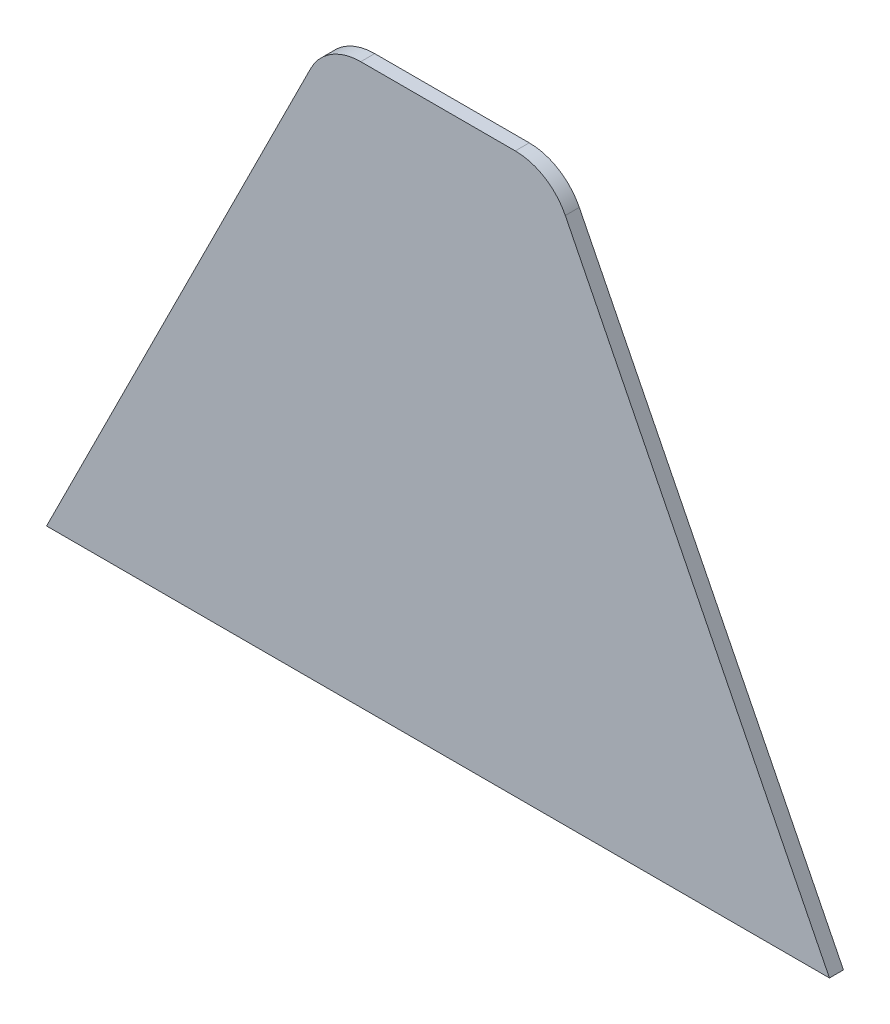
ISO-10303-21;
HEADER;
FILE_DESCRIPTION(('STEP AP214'),'2;1');
FILE_NAME('part.step','',(''),(''),'','','');
FILE_SCHEMA(('AUTOMOTIVE_DESIGN { 1 0 10303 214 1 1 1 1 }'));
ENDSEC;
DATA;
#1=APPLICATION_CONTEXT('core data for automotive mechanical design processes');
#2=APPLICATION_PROTOCOL_DEFINITION('international standard','automotive_design',2000,#1);
#3=PRODUCT_CONTEXT('',#1,'mechanical');
#4=PRODUCT('Part','Part','',(#3));
#5=PRODUCT_RELATED_PRODUCT_CATEGORY('part','',(#4));
#6=PRODUCT_DEFINITION_FORMATION('','',#4);
#7=PRODUCT_DEFINITION_CONTEXT('part definition',#1,'design');
#8=PRODUCT_DEFINITION('design','',#6,#7);
#9=PRODUCT_DEFINITION_SHAPE('','',#8);
#10=(LENGTH_UNIT() NAMED_UNIT(*) SI_UNIT(.MILLI.,.METRE.));
#11=(NAMED_UNIT(*) PLANE_ANGLE_UNIT() SI_UNIT($,.RADIAN.));
#12=(NAMED_UNIT(*) SI_UNIT($,.STERADIAN.) SOLID_ANGLE_UNIT());
#13=UNCERTAINTY_MEASURE_WITH_UNIT(LENGTH_MEASURE(1.E-05),#10,'distance_accuracy_value','');
#14=(GEOMETRIC_REPRESENTATION_CONTEXT(3) GLOBAL_UNCERTAINTY_ASSIGNED_CONTEXT((#13)) GLOBAL_UNIT_ASSIGNED_CONTEXT((#10,
#11,#12)) REPRESENTATION_CONTEXT('',''));
#15=CARTESIAN_POINT('',(0.,0.,0.));
#16=DIRECTION('',(0.,0.,1.));
#17=DIRECTION('',(1.,0.,0.));
#18=AXIS2_PLACEMENT_3D('',#15,#16,#17);
#19=CARTESIAN_POINT('',(177.8,0.,3.175));
#20=DIRECTION('',(0.,1.,0.));
#21=DIRECTION('',(0.,0.,1.));
#22=AXIS2_PLACEMENT_3D('',#19,#20,#21);
#23=PLANE('',#22);
#24=DIRECTION('',(1.,0.,0.));
#25=VECTOR('',#24,1.);
#26=CARTESIAN_POINT('',(177.8,0.,0.));
#27=LINE('',#26,#25);
#28=CARTESIAN_POINT('',(0.,0.,0.));
#29=VERTEX_POINT('',#28);
#30=CARTESIAN_POINT('',(177.8,0.,0.));
#31=VERTEX_POINT('',#30);
#32=EDGE_CURVE('E106',#29,#31,#27,.T.);
#33=ORIENTED_EDGE('',*,*,#32,.T.);
#34=DIRECTION('',(0.,0.,-1.));
#35=VECTOR('',#34,1.);
#36=CARTESIAN_POINT('',(177.8,0.,3.175));
#37=LINE('',#36,#35);
#38=CARTESIAN_POINT('',(177.8,0.,3.175));
#39=VERTEX_POINT('',#38);
#40=EDGE_CURVE('E91',#39,#31,#37,.T.);
#41=ORIENTED_EDGE('',*,*,#40,.F.);
#42=DIRECTION('',(1.,0.,0.));
#43=VECTOR('',#42,1.);
#44=CARTESIAN_POINT('',(177.8,0.,3.175));
#45=LINE('',#44,#43);
#46=CARTESIAN_POINT('',(0.,0.,3.175));
#47=VERTEX_POINT('',#46);
#48=EDGE_CURVE('E95',#47,#39,#45,.T.);
#49=ORIENTED_EDGE('',*,*,#48,.F.);
#50=DIRECTION('',(0.,0.,-1.));
#51=VECTOR('',#50,1.);
#52=CARTESIAN_POINT('',(0.,0.,3.175));
#53=LINE('',#52,#51);
#54=EDGE_CURVE('E108',#47,#29,#53,.T.);
#55=ORIENTED_EDGE('',*,*,#54,.T.);
#56=EDGE_LOOP('',(#33,#41,#49,#55));
#57=FACE_BOUND('',#56,.T.);
#58=ADVANCED_FACE('F34',(#57),#23,.F.);
#59=CARTESIAN_POINT('',(114.3,127.,3.175));
#60=DIRECTION('',(-0.894427190999916,-0.447213595499958,0.));
#61=DIRECTION('',(0.447213595499958,-0.894427190999916,0.));
#62=AXIS2_PLACEMENT_3D('',#59,#60,#61);
#63=PLANE('',#62);
#64=DIRECTION('',(-0.447213595499958,0.894427190999916,0.));
#65=VECTOR('',#64,1.);
#66=CARTESIAN_POINT('',(114.3,127.,0.));
#67=LINE('',#66,#65);
#68=CARTESIAN_POINT('',(117.810193668575,119.979612662849,0.));
#69=VERTEX_POINT('',#68);
#70=EDGE_CURVE('E134',#31,#69,#67,.T.);
#71=ORIENTED_EDGE('',*,*,#70,.T.);
#72=DIRECTION('',(0.,0.,-1.));
#73=VECTOR('',#72,1.);
#74=CARTESIAN_POINT('',(117.810193668575,119.979612662849,3.175));
#75=LINE('',#74,#73);
#76=CARTESIAN_POINT('',(117.810193668575,119.979612662849,3.175));
#77=VERTEX_POINT('',#76);
#78=EDGE_CURVE('E57',#69,#77,#75,.F.);
#79=ORIENTED_EDGE('',*,*,#78,.T.);
#80=DIRECTION('',(-0.447213595499958,0.894427190999916,0.));
#81=VECTOR('',#80,1.);
#82=CARTESIAN_POINT('',(114.3,127.,3.175));
#83=LINE('',#82,#81);
#84=EDGE_CURVE('E87',#39,#77,#83,.T.);
#85=ORIENTED_EDGE('',*,*,#84,.F.);
#86=ORIENTED_EDGE('',*,*,#40,.T.);
#87=EDGE_LOOP('',(#71,#79,#85,#86));
#88=FACE_BOUND('',#87,.T.);
#89=ADVANCED_FACE('F89',(#88),#63,.F.);
#90=CARTESIAN_POINT('',(63.4999999999999,127.,3.175));
#91=DIRECTION('',(0.,-1.,0.));
#92=DIRECTION('',(0.,0.,-1.));
#93=AXIS2_PLACEMENT_3D('',#90,#91,#92);
#94=PLANE('',#93);
#95=DIRECTION('',(-1.,0.,0.));
#96=VECTOR('',#95,1.);
#97=CARTESIAN_POINT('',(63.4999999999999,127.,3.175));
#98=LINE('',#97,#96);
#99=CARTESIAN_POINT('',(106.450968342876,127.,3.175));
#100=VERTEX_POINT('',#99);
#101=CARTESIAN_POINT('',(71.3490316571236,127.,3.175));
#102=VERTEX_POINT('',#101);
#103=EDGE_CURVE('E94',#100,#102,#98,.T.);
#104=ORIENTED_EDGE('',*,*,#103,.F.);
#105=DIRECTION('',(0.,0.,-1.));
#106=VECTOR('',#105,1.);
#107=CARTESIAN_POINT('',(106.450968342876,127.,3.175));
#108=LINE('',#107,#106);
#109=CARTESIAN_POINT('',(106.450968342876,127.,0.));
#110=VERTEX_POINT('',#109);
#111=EDGE_CURVE('E110',#100,#110,#108,.T.);
#112=ORIENTED_EDGE('',*,*,#111,.T.);
#113=DIRECTION('',(-1.,0.,0.));
#114=VECTOR('',#113,1.);
#115=CARTESIAN_POINT('',(63.4999999999999,127.,0.));
#116=LINE('',#115,#114);
#117=CARTESIAN_POINT('',(71.3490316571236,127.,0.));
#118=VERTEX_POINT('',#117);
#119=EDGE_CURVE('E135',#110,#118,#116,.T.);
#120=ORIENTED_EDGE('',*,*,#119,.T.);
#121=DIRECTION('',(0.,0.,-1.));
#122=VECTOR('',#121,1.);
#123=CARTESIAN_POINT('',(71.3490316571236,127.,3.175));
#124=LINE('',#123,#122);
#125=EDGE_CURVE('E107',#118,#102,#124,.F.);
#126=ORIENTED_EDGE('',*,*,#125,.T.);
#127=EDGE_LOOP('',(#104,#112,#120,#126));
#128=FACE_BOUND('',#127,.T.);
#129=ADVANCED_FACE('F126',(#128),#94,.F.);
#130=CARTESIAN_POINT('',(0.,0.,3.175));
#131=DIRECTION('',(0.894427190999916,-0.447213595499958,0.));
#132=DIRECTION('',(0.447213595499958,0.894427190999916,0.));
#133=AXIS2_PLACEMENT_3D('',#130,#131,#132);
#134=PLANE('',#133);
#135=DIRECTION('',(-0.447213595499958,-0.894427190999916,0.));
#136=VECTOR('',#135,1.);
#137=CARTESIAN_POINT('',(0.,0.,3.175));
#138=LINE('',#137,#136);
#139=CARTESIAN_POINT('',(59.9898063314247,119.979612662849,3.175));
#140=VERTEX_POINT('',#139);
#141=EDGE_CURVE('E99',#140,#47,#138,.T.);
#142=ORIENTED_EDGE('',*,*,#141,.F.);
#143=DIRECTION('',(0.,0.,-1.));
#144=VECTOR('',#143,1.);
#145=CARTESIAN_POINT('',(59.9898063314247,119.979612662849,3.175));
#146=LINE('',#145,#144);
#147=CARTESIAN_POINT('',(59.9898063314247,119.979612662849,0.));
#148=VERTEX_POINT('',#147);
#149=EDGE_CURVE('E11',#140,#148,#146,.T.);
#150=ORIENTED_EDGE('',*,*,#149,.T.);
#151=DIRECTION('',(-0.447213595499958,-0.894427190999916,0.));
#152=VECTOR('',#151,1.);
#153=CARTESIAN_POINT('',(0.,0.,0.));
#154=LINE('',#153,#152);
#155=EDGE_CURVE('E103',#148,#29,#154,.T.);
#156=ORIENTED_EDGE('',*,*,#155,.T.);
#157=ORIENTED_EDGE('',*,*,#54,.F.);
#158=EDGE_LOOP('',(#142,#150,#156,#157));
#159=FACE_BOUND('',#158,.T.);
#160=ADVANCED_FACE('F142',(#159),#134,.F.);
#161=CARTESIAN_POINT('',(0.,0.,3.175));
#162=DIRECTION('',(0.,0.,-1.));
#163=DIRECTION('',(-1.,0.,0.));
#164=AXIS2_PLACEMENT_3D('',#161,#162,#163);
#165=PLANE('',#164);
#166=ORIENTED_EDGE('',*,*,#84,.T.);
#167=CARTESIAN_POINT('',(106.450968342876,114.3,3.175));
#168=DIRECTION('',(0.,0.,-1.));
#169=DIRECTION('',(-1.,0.,0.));
#170=AXIS2_PLACEMENT_3D('',#167,#168,#169);
#171=CIRCLE('',#170,12.7);
#172=EDGE_CURVE('E42',#77,#100,#171,.F.);
#173=ORIENTED_EDGE('',*,*,#172,.T.);
#174=ORIENTED_EDGE('',*,*,#103,.T.);
#175=CARTESIAN_POINT('',(71.3490316571236,114.3,3.175));
#176=DIRECTION('',(0.,0.,-1.));
#177=DIRECTION('',(-1.,0.,0.));
#178=AXIS2_PLACEMENT_3D('',#175,#176,#177);
#179=CIRCLE('',#178,12.7);
#180=EDGE_CURVE('E49',#102,#140,#179,.F.);
#181=ORIENTED_EDGE('',*,*,#180,.T.);
#182=ORIENTED_EDGE('',*,*,#141,.T.);
#183=ORIENTED_EDGE('',*,*,#48,.T.);
#184=EDGE_LOOP('',(#166,#173,#174,#181,#182,#183));
#185=FACE_BOUND('',#184,.T.);
#186=ADVANCED_FACE('F98',(#185),#165,.F.);
#187=CARTESIAN_POINT('',(0.,0.,0.));
#188=DIRECTION('',(0.,0.,-1.));
#189=DIRECTION('',(-1.,0.,0.));
#190=AXIS2_PLACEMENT_3D('',#187,#188,#189);
#191=PLANE('',#190);
#192=ORIENTED_EDGE('',*,*,#119,.F.);
#193=CARTESIAN_POINT('',(106.450968342876,114.3,0.));
#194=DIRECTION('',(0.,0.,-1.));
#195=DIRECTION('',(-1.,0.,0.));
#196=AXIS2_PLACEMENT_3D('',#193,#194,#195);
#197=CIRCLE('',#196,12.7);
#198=EDGE_CURVE('E119',#110,#69,#197,.T.);
#199=ORIENTED_EDGE('',*,*,#198,.T.);
#200=ORIENTED_EDGE('',*,*,#70,.F.);
#201=ORIENTED_EDGE('',*,*,#32,.F.);
#202=ORIENTED_EDGE('',*,*,#155,.F.);
#203=CARTESIAN_POINT('',(71.3490316571236,114.3,0.));
#204=DIRECTION('',(0.,0.,-1.));
#205=DIRECTION('',(-1.,0.,0.));
#206=AXIS2_PLACEMENT_3D('',#203,#204,#205);
#207=CIRCLE('',#206,12.7);
#208=EDGE_CURVE('E117',#148,#118,#207,.T.);
#209=ORIENTED_EDGE('',*,*,#208,.T.);
#210=EDGE_LOOP('',(#192,#199,#200,#201,#202,#209));
#211=FACE_BOUND('',#210,.T.);
#212=ADVANCED_FACE('F133',(#211),#191,.T.);
#213=CARTESIAN_POINT('',(106.450968342876,114.3,3.175));
#214=DIRECTION('',(0.,0.,-1.));
#215=DIRECTION('',(-1.,0.,0.));
#216=AXIS2_PLACEMENT_3D('',#213,#214,#215);
#217=CYLINDRICAL_SURFACE('',#216,12.7);
#218=ORIENTED_EDGE('',*,*,#172,.F.);
#219=ORIENTED_EDGE('',*,*,#78,.F.);
#220=ORIENTED_EDGE('',*,*,#198,.F.);
#221=ORIENTED_EDGE('',*,*,#111,.F.);
#222=EDGE_LOOP('',(#218,#219,#220,#221));
#223=FACE_BOUND('',#222,.T.);
#224=ADVANCED_FACE('F131',(#223),#217,.T.);
#225=CARTESIAN_POINT('',(71.3490316571236,114.3,3.175));
#226=DIRECTION('',(0.,0.,-1.));
#227=DIRECTION('',(-1.,0.,0.));
#228=AXIS2_PLACEMENT_3D('',#225,#226,#227);
#229=CYLINDRICAL_SURFACE('',#228,12.7);
#230=ORIENTED_EDGE('',*,*,#180,.F.);
#231=ORIENTED_EDGE('',*,*,#125,.F.);
#232=ORIENTED_EDGE('',*,*,#208,.F.);
#233=ORIENTED_EDGE('',*,*,#149,.F.);
#234=EDGE_LOOP('',(#230,#231,#232,#233));
#235=FACE_BOUND('',#234,.T.);
#236=ADVANCED_FACE('F36',(#235),#229,.T.);
#237=CLOSED_SHELL('',(#58,#89,#129,#160,#186,#212,#224,#236));
#238=MANIFOLD_SOLID_BREP('B2',#237);
#239=ADVANCED_BREP_SHAPE_REPRESENTATION('',(#18,#238),#14);
#240=SHAPE_DEFINITION_REPRESENTATION(#9,#239);
ENDSEC;
END-ISO-10303-21;
